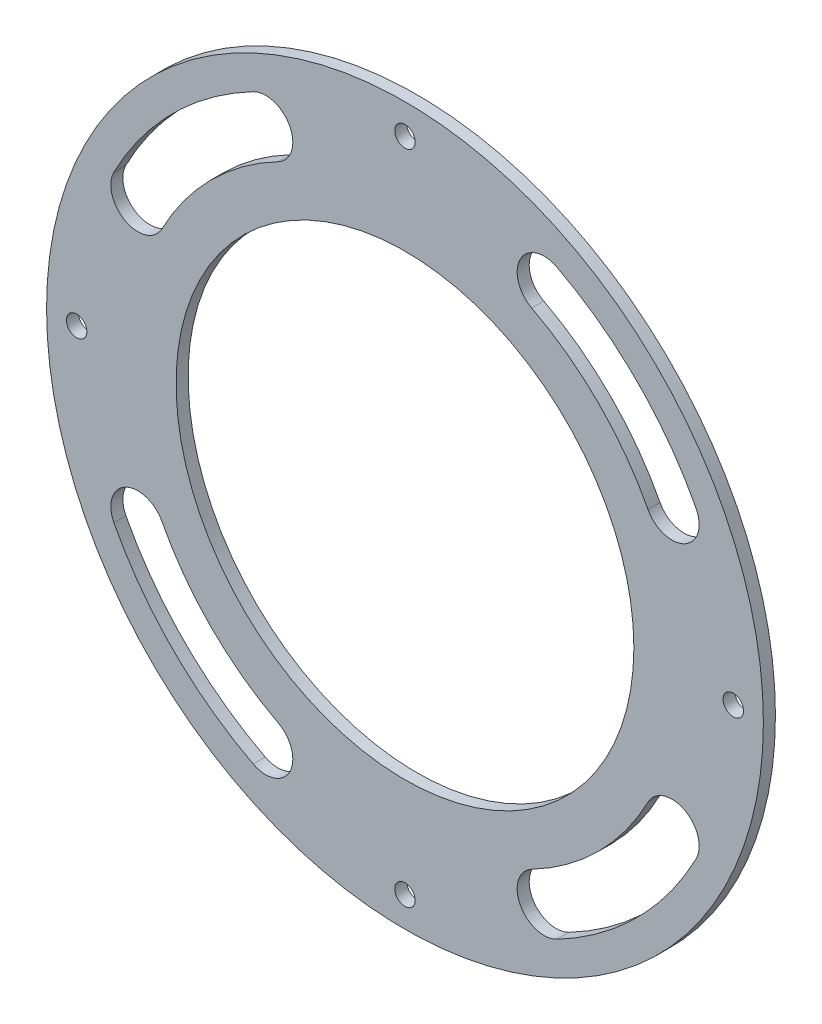
ISO-10303-21;
HEADER;
FILE_DESCRIPTION(('STEP AP214'),'2;1');
FILE_NAME('part.step','',(''),(''),'','','');
FILE_SCHEMA(('AUTOMOTIVE_DESIGN { 1 0 10303 214 1 1 1 1 }'));
ENDSEC;
DATA;
#1=APPLICATION_CONTEXT('core data for automotive mechanical design processes');
#2=APPLICATION_PROTOCOL_DEFINITION('international standard','automotive_design',2000,#1);
#3=PRODUCT_CONTEXT('',#1,'mechanical');
#4=PRODUCT('Part','Part','',(#3));
#5=PRODUCT_RELATED_PRODUCT_CATEGORY('part','',(#4));
#6=PRODUCT_DEFINITION_FORMATION('','',#4);
#7=PRODUCT_DEFINITION_CONTEXT('part definition',#1,'design');
#8=PRODUCT_DEFINITION('design','',#6,#7);
#9=PRODUCT_DEFINITION_SHAPE('','',#8);
#10=(LENGTH_UNIT() NAMED_UNIT(*) SI_UNIT(.MILLI.,.METRE.));
#11=(NAMED_UNIT(*) PLANE_ANGLE_UNIT() SI_UNIT($,.RADIAN.));
#12=(NAMED_UNIT(*) SI_UNIT($,.STERADIAN.) SOLID_ANGLE_UNIT());
#13=UNCERTAINTY_MEASURE_WITH_UNIT(LENGTH_MEASURE(1.E-05),#10,'distance_accuracy_value','');
#14=(GEOMETRIC_REPRESENTATION_CONTEXT(3) GLOBAL_UNCERTAINTY_ASSIGNED_CONTEXT((#13)) GLOBAL_UNIT_ASSIGNED_CONTEXT((#10,
#11,#12)) REPRESENTATION_CONTEXT('',''));
#15=CARTESIAN_POINT('',(0.,0.,0.));
#16=DIRECTION('',(0.,0.,1.));
#17=DIRECTION('',(1.,0.,0.));
#18=AXIS2_PLACEMENT_3D('',#15,#16,#17);
#19=CARTESIAN_POINT('',(0.,0.,2.));
#20=DIRECTION('',(0.,0.,-1.));
#21=DIRECTION('',(-1.,0.,0.));
#22=AXIS2_PLACEMENT_3D('',#19,#20,#21);
#23=CYLINDRICAL_SURFACE('',#22,59.5);
#24=CARTESIAN_POINT('',(0.,0.,2.));
#25=DIRECTION('',(0.,0.,1.));
#26=DIRECTION('',(1.,0.,0.));
#27=AXIS2_PLACEMENT_3D('',#24,#25,#26);
#28=CIRCLE('',#27,59.5);
#29=CARTESIAN_POINT('',(59.5,0.,2.));
#30=VERTEX_POINT('',#29);
#31=EDGE_CURVE('E12',#30,#30,#28,.T.);
#32=ORIENTED_EDGE('',*,*,#31,.F.);
#33=EDGE_LOOP('',(#32));
#34=FACE_BOUND('',#33,.T.);
#35=CARTESIAN_POINT('',(0.,0.,0.));
#36=DIRECTION('',(0.,0.,1.));
#37=DIRECTION('',(1.,0.,0.));
#38=AXIS2_PLACEMENT_3D('',#35,#36,#37);
#39=CIRCLE('',#38,59.5);
#40=CARTESIAN_POINT('',(59.5,0.,0.));
#41=VERTEX_POINT('',#40);
#42=EDGE_CURVE('E65',#41,#41,#39,.T.);
#43=ORIENTED_EDGE('',*,*,#42,.T.);
#44=EDGE_LOOP('',(#43));
#45=FACE_BOUND('',#44,.T.);
#46=ADVANCED_FACE('F61',(#34,#45),#23,.T.);
#47=CARTESIAN_POINT('',(-54.5,5.50341022753642E-13,2.));
#48=DIRECTION('',(0.,0.,-1.));
#49=DIRECTION('',(-1.,0.,0.));
#50=AXIS2_PLACEMENT_3D('',#47,#48,#49);
#51=CYLINDRICAL_SURFACE('',#50,1.7);
#52=CARTESIAN_POINT('',(-54.5,5.50341022753642E-13,2.));
#53=DIRECTION('',(0.,0.,1.));
#54=DIRECTION('',(1.,0.,0.));
#55=AXIS2_PLACEMENT_3D('',#52,#53,#54);
#56=CIRCLE('',#55,1.7);
#57=CARTESIAN_POINT('',(-52.8,5.50341022753642E-13,2.));
#58=VERTEX_POINT('',#57);
#59=EDGE_CURVE('E70',#58,#58,#56,.T.);
#60=ORIENTED_EDGE('',*,*,#59,.T.);
#61=EDGE_LOOP('',(#60));
#62=FACE_BOUND('',#61,.T.);
#63=CARTESIAN_POINT('',(-54.5,5.50341022753642E-13,0.));
#64=DIRECTION('',(0.,0.,1.));
#65=DIRECTION('',(1.,0.,0.));
#66=AXIS2_PLACEMENT_3D('',#63,#64,#65);
#67=CIRCLE('',#66,1.7);
#68=CARTESIAN_POINT('',(-52.8,5.50341022753642E-13,0.));
#69=VERTEX_POINT('',#68);
#70=EDGE_CURVE('E334',#69,#69,#67,.T.);
#71=ORIENTED_EDGE('',*,*,#70,.F.);
#72=EDGE_LOOP('',(#71));
#73=FACE_BOUND('',#72,.T.);
#74=ADVANCED_FACE('F357',(#62,#73),#51,.F.);
#75=CARTESIAN_POINT('',(-5.3218063636451E-13,-54.4999999999995,2.));
#76=DIRECTION('',(0.,0.,-1.));
#77=DIRECTION('',(-1.,0.,0.));
#78=AXIS2_PLACEMENT_3D('',#75,#76,#77);
#79=CYLINDRICAL_SURFACE('',#78,1.7);
#80=CARTESIAN_POINT('',(-5.3218063636451E-13,-54.4999999999995,2.));
#81=DIRECTION('',(0.,0.,1.));
#82=DIRECTION('',(1.,0.,0.));
#83=AXIS2_PLACEMENT_3D('',#80,#81,#82);
#84=CIRCLE('',#83,1.7);
#85=CARTESIAN_POINT('',(1.69999999999947,-54.4999999999995,2.));
#86=VERTEX_POINT('',#85);
#87=EDGE_CURVE('E322',#86,#86,#84,.T.);
#88=ORIENTED_EDGE('',*,*,#87,.T.);
#89=EDGE_LOOP('',(#88));
#90=FACE_BOUND('',#89,.T.);
#91=CARTESIAN_POINT('',(-5.3218063636451E-13,-54.4999999999995,0.));
#92=DIRECTION('',(0.,0.,1.));
#93=DIRECTION('',(1.,0.,0.));
#94=AXIS2_PLACEMENT_3D('',#91,#92,#93);
#95=CIRCLE('',#94,1.7);
#96=CARTESIAN_POINT('',(1.69999999999947,-54.4999999999995,0.));
#97=VERTEX_POINT('',#96);
#98=EDGE_CURVE('E332',#97,#97,#95,.T.);
#99=ORIENTED_EDGE('',*,*,#98,.F.);
#100=EDGE_LOOP('',(#99));
#101=FACE_BOUND('',#100,.T.);
#102=ADVANCED_FACE('F362',(#90,#101),#79,.F.);
#103=CARTESIAN_POINT('',(54.4999999999995,0.,2.));
#104=DIRECTION('',(0.,0.,-1.));
#105=DIRECTION('',(-1.,0.,0.));
#106=AXIS2_PLACEMENT_3D('',#103,#104,#105);
#107=CYLINDRICAL_SURFACE('',#106,1.7);
#108=CARTESIAN_POINT('',(54.4999999999995,0.,2.));
#109=DIRECTION('',(0.,0.,1.));
#110=DIRECTION('',(1.,0.,0.));
#111=AXIS2_PLACEMENT_3D('',#108,#109,#110);
#112=CIRCLE('',#111,1.7);
#113=CARTESIAN_POINT('',(56.1999999999995,0.,2.));
#114=VERTEX_POINT('',#113);
#115=EDGE_CURVE('E319',#114,#114,#112,.T.);
#116=ORIENTED_EDGE('',*,*,#115,.T.);
#117=EDGE_LOOP('',(#116));
#118=FACE_BOUND('',#117,.T.);
#119=CARTESIAN_POINT('',(54.4999999999995,0.,0.));
#120=DIRECTION('',(0.,0.,1.));
#121=DIRECTION('',(1.,0.,0.));
#122=AXIS2_PLACEMENT_3D('',#119,#120,#121);
#123=CIRCLE('',#122,1.7);
#124=CARTESIAN_POINT('',(56.1999999999995,0.,0.));
#125=VERTEX_POINT('',#124);
#126=EDGE_CURVE('E329',#125,#125,#123,.T.);
#127=ORIENTED_EDGE('',*,*,#126,.F.);
#128=EDGE_LOOP('',(#127));
#129=FACE_BOUND('',#128,.T.);
#130=ADVANCED_FACE('F353',(#118,#129),#107,.F.);
#131=CARTESIAN_POINT('',(0.,54.5,2.));
#132=DIRECTION('',(0.,0.,-1.));
#133=DIRECTION('',(-1.,0.,0.));
#134=AXIS2_PLACEMENT_3D('',#131,#132,#133);
#135=CYLINDRICAL_SURFACE('',#134,1.7);
#136=CARTESIAN_POINT('',(0.,54.5,2.));
#137=DIRECTION('',(0.,0.,1.));
#138=DIRECTION('',(1.,0.,0.));
#139=AXIS2_PLACEMENT_3D('',#136,#137,#138);
#140=CIRCLE('',#139,1.7);
#141=CARTESIAN_POINT('',(1.69999999999999,54.5,2.));
#142=VERTEX_POINT('',#141);
#143=EDGE_CURVE('E316',#142,#142,#140,.T.);
#144=ORIENTED_EDGE('',*,*,#143,.T.);
#145=EDGE_LOOP('',(#144));
#146=FACE_BOUND('',#145,.T.);
#147=CARTESIAN_POINT('',(0.,54.5,0.));
#148=DIRECTION('',(0.,0.,1.));
#149=DIRECTION('',(1.,0.,0.));
#150=AXIS2_PLACEMENT_3D('',#147,#148,#149);
#151=CIRCLE('',#150,1.7);
#152=CARTESIAN_POINT('',(1.69999999999999,54.5,0.));
#153=VERTEX_POINT('',#152);
#154=EDGE_CURVE('E313',#153,#153,#151,.T.);
#155=ORIENTED_EDGE('',*,*,#154,.F.);
#156=EDGE_LOOP('',(#155));
#157=FACE_BOUND('',#156,.T.);
#158=ADVANCED_FACE('F63',(#146,#157),#135,.F.);
#159=CARTESIAN_POINT('',(0.,0.,0.));
#160=DIRECTION('',(0.,0.,1.));
#161=DIRECTION('',(1.,0.,0.));
#162=AXIS2_PLACEMENT_3D('',#159,#160,#161);
#163=PLANE('',#162);
#164=CARTESIAN_POINT('',(-23.1202421902823,44.3334456258781,0.));
#165=DIRECTION('',(0.,0.,1.));
#166=DIRECTION('',(0.,1.,0.));
#167=AXIS2_PLACEMENT_3D('',#164,#165,#166);
#168=CIRCLE('',#167,4.5);
#169=CARTESIAN_POINT('',(-21.0394203931569,40.3434355195491,0.));
#170=VERTEX_POINT('',#169);
#171=CARTESIAN_POINT('',(-25.2010639874077,48.3234557322071,0.));
#172=VERTEX_POINT('',#171);
#173=EDGE_CURVE('E186',#170,#172,#168,.T.);
#174=ORIENTED_EDGE('',*,*,#173,.T.);
#175=CARTESIAN_POINT('',(0.,0.,0.));
#176=DIRECTION('',(0.,0.,1.));
#177=DIRECTION('',(0.,1.,0.));
#178=AXIS2_PLACEMENT_3D('',#175,#176,#177);
#179=CIRCLE('',#178,54.5);
#180=CARTESIAN_POINT('',(-48.3234557322076,25.2010639874068,0.));
#181=VERTEX_POINT('',#180);
#182=EDGE_CURVE('E181',#172,#181,#179,.T.);
#183=ORIENTED_EDGE('',*,*,#182,.T.);
#184=CARTESIAN_POINT('',(-44.3334456258785,23.1202421902815,0.));
#185=DIRECTION('',(0.,0.,1.));
#186=DIRECTION('',(0.,1.,0.));
#187=AXIS2_PLACEMENT_3D('',#184,#185,#186);
#188=CIRCLE('',#187,4.5);
#189=CARTESIAN_POINT('',(-40.3434355195495,21.0394203931561,0.));
#190=VERTEX_POINT('',#189);
#191=EDGE_CURVE('E189',#181,#190,#188,.T.);
#192=ORIENTED_EDGE('',*,*,#191,.T.);
#193=CARTESIAN_POINT('',(0.,0.,0.));
#194=DIRECTION('',(0.,0.,1.));
#195=DIRECTION('',(0.,1.,0.));
#196=AXIS2_PLACEMENT_3D('',#193,#194,#195);
#197=CIRCLE('',#196,45.5);
#198=EDGE_CURVE('E193',#170,#190,#197,.T.);
#199=ORIENTED_EDGE('',*,*,#198,.F.);
#200=EDGE_LOOP('',(#174,#183,#192,#199));
#201=FACE_BOUND('',#200,.T.);
#202=CARTESIAN_POINT('',(-44.3334456258782,-23.1202421902821,0.));
#203=DIRECTION('',(0.,0.,1.));
#204=DIRECTION('',(-1.,0.,0.));
#205=AXIS2_PLACEMENT_3D('',#202,#203,#204);
#206=CIRCLE('',#205,4.5);
#207=CARTESIAN_POINT('',(-40.3434355195491,-21.0394203931567,0.));
#208=VERTEX_POINT('',#207);
#209=CARTESIAN_POINT('',(-48.3234557322072,-25.2010639874075,0.));
#210=VERTEX_POINT('',#209);
#211=EDGE_CURVE('E227',#208,#210,#206,.T.);
#212=ORIENTED_EDGE('',*,*,#211,.T.);
#213=CARTESIAN_POINT('',(0.,0.,0.));
#214=DIRECTION('',(0.,0.,1.));
#215=DIRECTION('',(-1.,0.,0.));
#216=AXIS2_PLACEMENT_3D('',#213,#214,#215);
#217=CIRCLE('',#216,54.5);
#218=CARTESIAN_POINT('',(-25.201063987407,-48.3234557322075,0.));
#219=VERTEX_POINT('',#218);
#220=EDGE_CURVE('E218',#210,#219,#217,.T.);
#221=ORIENTED_EDGE('',*,*,#220,.T.);
#222=CARTESIAN_POINT('',(-23.1202421902816,-44.3334456258784,0.));
#223=DIRECTION('',(0.,0.,1.));
#224=DIRECTION('',(-1.,0.,0.));
#225=AXIS2_PLACEMENT_3D('',#222,#223,#224);
#226=CIRCLE('',#225,4.5);
#227=CARTESIAN_POINT('',(-21.0394203931563,-40.3434355195494,0.));
#228=VERTEX_POINT('',#227);
#229=EDGE_CURVE('E221',#219,#228,#226,.T.);
#230=ORIENTED_EDGE('',*,*,#229,.T.);
#231=CARTESIAN_POINT('',(0.,0.,0.));
#232=DIRECTION('',(0.,0.,1.));
#233=DIRECTION('',(-1.,0.,0.));
#234=AXIS2_PLACEMENT_3D('',#231,#232,#233);
#235=CIRCLE('',#234,45.5);
#236=EDGE_CURVE('E225',#208,#228,#235,.T.);
#237=ORIENTED_EDGE('',*,*,#236,.F.);
#238=EDGE_LOOP('',(#212,#221,#230,#237));
#239=FACE_BOUND('',#238,.T.);
#240=CARTESIAN_POINT('',(23.1202421902826,-44.3334456258779,0.));
#241=DIRECTION('',(0.,0.,1.));
#242=DIRECTION('',(0.,-1.,0.));
#243=AXIS2_PLACEMENT_3D('',#240,#241,#242);
#244=CIRCLE('',#243,4.5);
#245=CARTESIAN_POINT('',(21.0394203931572,-40.3434355195489,0.));
#246=VERTEX_POINT('',#245);
#247=CARTESIAN_POINT('',(25.201063987408,-48.323455732207,0.));
#248=VERTEX_POINT('',#247);
#249=EDGE_CURVE('E257',#246,#248,#244,.T.);
#250=ORIENTED_EDGE('',*,*,#249,.T.);
#251=CARTESIAN_POINT('',(0.,0.,0.));
#252=DIRECTION('',(0.,0.,1.));
#253=DIRECTION('',(0.,-1.,0.));
#254=AXIS2_PLACEMENT_3D('',#251,#252,#253);
#255=CIRCLE('',#254,54.5);
#256=CARTESIAN_POINT('',(48.3234557322078,-25.2010639874065,0.));
#257=VERTEX_POINT('',#256);
#258=EDGE_CURVE('E247',#248,#257,#255,.T.);
#259=ORIENTED_EDGE('',*,*,#258,.T.);
#260=CARTESIAN_POINT('',(44.3334456258787,-23.1202421902812,0.));
#261=DIRECTION('',(0.,0.,1.));
#262=DIRECTION('',(0.,-1.,0.));
#263=AXIS2_PLACEMENT_3D('',#260,#261,#262);
#264=CIRCLE('',#263,4.5);
#265=CARTESIAN_POINT('',(40.3434355195496,-21.0394203931559,0.));
#266=VERTEX_POINT('',#265);
#267=EDGE_CURVE('E250',#257,#266,#264,.T.);
#268=ORIENTED_EDGE('',*,*,#267,.T.);
#269=CARTESIAN_POINT('',(0.,0.,0.));
#270=DIRECTION('',(0.,0.,1.));
#271=DIRECTION('',(0.,-1.,0.));
#272=AXIS2_PLACEMENT_3D('',#269,#270,#271);
#273=CIRCLE('',#272,45.5);
#274=EDGE_CURVE('E254',#246,#266,#273,.T.);
#275=ORIENTED_EDGE('',*,*,#274,.F.);
#276=EDGE_LOOP('',(#250,#259,#268,#275));
#277=FACE_BOUND('',#276,.T.);
#278=CARTESIAN_POINT('',(44.3334456258782,23.1202421902821,0.));
#279=DIRECTION('',(0.,0.,1.));
#280=DIRECTION('',(1.,0.,0.));
#281=AXIS2_PLACEMENT_3D('',#278,#279,#280);
#282=CIRCLE('',#281,4.5);
#283=CARTESIAN_POINT('',(40.3434355195491,21.0394203931567,0.));
#284=VERTEX_POINT('',#283);
#285=CARTESIAN_POINT('',(48.3234557322072,25.2010639874075,0.));
#286=VERTEX_POINT('',#285);
#287=EDGE_CURVE('E288',#284,#286,#282,.T.);
#288=ORIENTED_EDGE('',*,*,#287,.T.);
#289=CARTESIAN_POINT('',(0.,0.,0.));
#290=DIRECTION('',(0.,0.,1.));
#291=DIRECTION('',(1.,0.,0.));
#292=AXIS2_PLACEMENT_3D('',#289,#290,#291);
#293=CIRCLE('',#292,54.5);
#294=CARTESIAN_POINT('',(25.201063987407,48.3234557322075,0.));
#295=VERTEX_POINT('',#294);
#296=EDGE_CURVE('E278',#286,#295,#293,.T.);
#297=ORIENTED_EDGE('',*,*,#296,.T.);
#298=CARTESIAN_POINT('',(23.1202421902816,44.3334456258784,0.));
#299=DIRECTION('',(0.,0.,1.));
#300=DIRECTION('',(1.,0.,0.));
#301=AXIS2_PLACEMENT_3D('',#298,#299,#300);
#302=CIRCLE('',#301,4.5);
#303=CARTESIAN_POINT('',(21.0394203931563,40.3434355195494,0.));
#304=VERTEX_POINT('',#303);
#305=EDGE_CURVE('E281',#295,#304,#302,.T.);
#306=ORIENTED_EDGE('',*,*,#305,.T.);
#307=CARTESIAN_POINT('',(0.,0.,0.));
#308=DIRECTION('',(0.,0.,1.));
#309=DIRECTION('',(1.,0.,0.));
#310=AXIS2_PLACEMENT_3D('',#307,#308,#309);
#311=CIRCLE('',#310,45.5);
#312=EDGE_CURVE('E285',#284,#304,#311,.T.);
#313=ORIENTED_EDGE('',*,*,#312,.F.);
#314=EDGE_LOOP('',(#288,#297,#306,#313));
#315=FACE_BOUND('',#314,.T.);
#316=CARTESIAN_POINT('',(0.,0.,0.));
#317=DIRECTION('',(0.,0.,1.));
#318=DIRECTION('',(1.,0.,0.));
#319=AXIS2_PLACEMENT_3D('',#316,#317,#318);
#320=CIRCLE('',#319,38.);
#321=CARTESIAN_POINT('',(38.,0.,0.));
#322=VERTEX_POINT('',#321);
#323=EDGE_CURVE('E310',#322,#322,#320,.T.);
#324=ORIENTED_EDGE('',*,*,#323,.T.);
#325=EDGE_LOOP('',(#324));
#326=FACE_BOUND('',#325,.T.);
#327=ORIENTED_EDGE('',*,*,#154,.T.);
#328=EDGE_LOOP('',(#327));
#329=FACE_BOUND('',#328,.T.);
#330=ORIENTED_EDGE('',*,*,#126,.T.);
#331=EDGE_LOOP('',(#330));
#332=FACE_BOUND('',#331,.T.);
#333=ORIENTED_EDGE('',*,*,#98,.T.);
#334=EDGE_LOOP('',(#333));
#335=FACE_BOUND('',#334,.T.);
#336=ORIENTED_EDGE('',*,*,#70,.T.);
#337=EDGE_LOOP('',(#336));
#338=FACE_BOUND('',#337,.T.);
#339=ORIENTED_EDGE('',*,*,#42,.F.);
#340=EDGE_LOOP('',(#339));
#341=FACE_BOUND('',#340,.T.);
#342=ADVANCED_FACE('F195',(#201,#239,#277,#315,#326,#329,#332,#335,#338,#341),#163,.F.);
#343=CARTESIAN_POINT('',(0.,0.,2.));
#344=DIRECTION('',(0.,0.,1.));
#345=DIRECTION('',(1.,0.,0.));
#346=AXIS2_PLACEMENT_3D('',#343,#344,#345);
#347=PLANE('',#346);
#348=CARTESIAN_POINT('',(0.,0.,2.));
#349=DIRECTION('',(0.,0.,1.));
#350=DIRECTION('',(0.,1.,0.));
#351=AXIS2_PLACEMENT_3D('',#348,#349,#350);
#352=CIRCLE('',#351,54.5);
#353=CARTESIAN_POINT('',(-25.2010639874077,48.3234557322071,2.));
#354=VERTEX_POINT('',#353);
#355=CARTESIAN_POINT('',(-48.3234557322076,25.2010639874068,2.));
#356=VERTEX_POINT('',#355);
#357=EDGE_CURVE('E184',#354,#356,#352,.T.);
#358=ORIENTED_EDGE('',*,*,#357,.F.);
#359=CARTESIAN_POINT('',(-23.1202421902823,44.3334456258781,2.));
#360=DIRECTION('',(0.,0.,1.));
#361=DIRECTION('',(0.,1.,0.));
#362=AXIS2_PLACEMENT_3D('',#359,#360,#361);
#363=CIRCLE('',#362,4.5);
#364=CARTESIAN_POINT('',(-21.0394203931569,40.3434355195491,2.));
#365=VERTEX_POINT('',#364);
#366=EDGE_CURVE('E198',#365,#354,#363,.T.);
#367=ORIENTED_EDGE('',*,*,#366,.F.);
#368=CARTESIAN_POINT('',(0.,0.,2.));
#369=DIRECTION('',(0.,0.,1.));
#370=DIRECTION('',(0.,1.,0.));
#371=AXIS2_PLACEMENT_3D('',#368,#369,#370);
#372=CIRCLE('',#371,45.5);
#373=CARTESIAN_POINT('',(-40.3434355195495,21.0394203931561,2.));
#374=VERTEX_POINT('',#373);
#375=EDGE_CURVE('E201',#365,#374,#372,.T.);
#376=ORIENTED_EDGE('',*,*,#375,.T.);
#377=CARTESIAN_POINT('',(-44.3334456258785,23.1202421902815,2.));
#378=DIRECTION('',(0.,0.,1.));
#379=DIRECTION('',(0.,1.,0.));
#380=AXIS2_PLACEMENT_3D('',#377,#378,#379);
#381=CIRCLE('',#380,4.5);
#382=EDGE_CURVE('E207',#356,#374,#381,.T.);
#383=ORIENTED_EDGE('',*,*,#382,.F.);
#384=EDGE_LOOP('',(#358,#367,#376,#383));
#385=FACE_BOUND('',#384,.T.);
#386=CARTESIAN_POINT('',(0.,0.,2.));
#387=DIRECTION('',(0.,0.,1.));
#388=DIRECTION('',(-1.,0.,0.));
#389=AXIS2_PLACEMENT_3D('',#386,#387,#388);
#390=CIRCLE('',#389,54.5);
#391=CARTESIAN_POINT('',(-48.3234557322072,-25.2010639874075,2.));
#392=VERTEX_POINT('',#391);
#393=CARTESIAN_POINT('',(-25.201063987407,-48.3234557322075,2.));
#394=VERTEX_POINT('',#393);
#395=EDGE_CURVE('E231',#392,#394,#390,.T.);
#396=ORIENTED_EDGE('',*,*,#395,.F.);
#397=CARTESIAN_POINT('',(-44.3334456258782,-23.1202421902821,2.));
#398=DIRECTION('',(0.,0.,1.));
#399=DIRECTION('',(-1.,0.,0.));
#400=AXIS2_PLACEMENT_3D('',#397,#398,#399);
#401=CIRCLE('',#400,4.5);
#402=CARTESIAN_POINT('',(-40.3434355195491,-21.0394203931567,2.));
#403=VERTEX_POINT('',#402);
#404=EDGE_CURVE('E222',#403,#392,#401,.T.);
#405=ORIENTED_EDGE('',*,*,#404,.F.);
#406=CARTESIAN_POINT('',(0.,0.,2.));
#407=DIRECTION('',(0.,0.,1.));
#408=DIRECTION('',(-1.,0.,0.));
#409=AXIS2_PLACEMENT_3D('',#406,#407,#408);
#410=CIRCLE('',#409,45.5);
#411=CARTESIAN_POINT('',(-21.0394203931563,-40.3434355195494,2.));
#412=VERTEX_POINT('',#411);
#413=EDGE_CURVE('E236',#403,#412,#410,.T.);
#414=ORIENTED_EDGE('',*,*,#413,.T.);
#415=CARTESIAN_POINT('',(-23.1202421902816,-44.3334456258784,2.));
#416=DIRECTION('',(0.,0.,1.));
#417=DIRECTION('',(-1.,0.,0.));
#418=AXIS2_PLACEMENT_3D('',#415,#416,#417);
#419=CIRCLE('',#418,4.5);
#420=EDGE_CURVE('E233',#394,#412,#419,.T.);
#421=ORIENTED_EDGE('',*,*,#420,.F.);
#422=EDGE_LOOP('',(#396,#405,#414,#421));
#423=FACE_BOUND('',#422,.T.);
#424=CARTESIAN_POINT('',(0.,0.,2.));
#425=DIRECTION('',(0.,0.,1.));
#426=DIRECTION('',(0.,-1.,0.));
#427=AXIS2_PLACEMENT_3D('',#424,#425,#426);
#428=CIRCLE('',#427,54.5);
#429=CARTESIAN_POINT('',(25.201063987408,-48.323455732207,2.));
#430=VERTEX_POINT('',#429);
#431=CARTESIAN_POINT('',(48.3234557322078,-25.2010639874065,2.));
#432=VERTEX_POINT('',#431);
#433=EDGE_CURVE('E261',#430,#432,#428,.T.);
#434=ORIENTED_EDGE('',*,*,#433,.F.);
#435=CARTESIAN_POINT('',(23.1202421902826,-44.3334456258779,2.));
#436=DIRECTION('',(0.,0.,1.));
#437=DIRECTION('',(0.,-1.,0.));
#438=AXIS2_PLACEMENT_3D('',#435,#436,#437);
#439=CIRCLE('',#438,4.5);
#440=CARTESIAN_POINT('',(21.0394203931572,-40.3434355195489,2.));
#441=VERTEX_POINT('',#440);
#442=EDGE_CURVE('E251',#441,#430,#439,.T.);
#443=ORIENTED_EDGE('',*,*,#442,.F.);
#444=CARTESIAN_POINT('',(0.,0.,2.));
#445=DIRECTION('',(0.,0.,1.));
#446=DIRECTION('',(0.,-1.,0.));
#447=AXIS2_PLACEMENT_3D('',#444,#445,#446);
#448=CIRCLE('',#447,45.5);
#449=CARTESIAN_POINT('',(40.3434355195496,-21.0394203931559,2.));
#450=VERTEX_POINT('',#449);
#451=EDGE_CURVE('E266',#441,#450,#448,.T.);
#452=ORIENTED_EDGE('',*,*,#451,.T.);
#453=CARTESIAN_POINT('',(44.3334456258787,-23.1202421902812,2.));
#454=DIRECTION('',(0.,0.,1.));
#455=DIRECTION('',(0.,-1.,0.));
#456=AXIS2_PLACEMENT_3D('',#453,#454,#455);
#457=CIRCLE('',#456,4.5);
#458=EDGE_CURVE('E263',#432,#450,#457,.T.);
#459=ORIENTED_EDGE('',*,*,#458,.F.);
#460=EDGE_LOOP('',(#434,#443,#452,#459));
#461=FACE_BOUND('',#460,.T.);
#462=CARTESIAN_POINT('',(0.,0.,2.));
#463=DIRECTION('',(0.,0.,1.));
#464=DIRECTION('',(1.,0.,0.));
#465=AXIS2_PLACEMENT_3D('',#462,#463,#464);
#466=CIRCLE('',#465,54.5);
#467=CARTESIAN_POINT('',(48.3234557322072,25.2010639874075,2.));
#468=VERTEX_POINT('',#467);
#469=CARTESIAN_POINT('',(25.201063987407,48.3234557322075,2.));
#470=VERTEX_POINT('',#469);
#471=EDGE_CURVE('E214',#468,#470,#466,.T.);
#472=ORIENTED_EDGE('',*,*,#471,.F.);
#473=CARTESIAN_POINT('',(44.3334456258782,23.1202421902821,2.));
#474=DIRECTION('',(0.,0.,1.));
#475=DIRECTION('',(1.,0.,0.));
#476=AXIS2_PLACEMENT_3D('',#473,#474,#475);
#477=CIRCLE('',#476,4.5);
#478=CARTESIAN_POINT('',(40.3434355195491,21.0394203931567,2.));
#479=VERTEX_POINT('',#478);
#480=EDGE_CURVE('E282',#479,#468,#477,.T.);
#481=ORIENTED_EDGE('',*,*,#480,.F.);
#482=CARTESIAN_POINT('',(0.,0.,2.));
#483=DIRECTION('',(0.,0.,1.));
#484=DIRECTION('',(1.,0.,0.));
#485=AXIS2_PLACEMENT_3D('',#482,#483,#484);
#486=CIRCLE('',#485,45.5);
#487=CARTESIAN_POINT('',(21.0394203931563,40.3434355195494,2.));
#488=VERTEX_POINT('',#487);
#489=EDGE_CURVE('E296',#479,#488,#486,.T.);
#490=ORIENTED_EDGE('',*,*,#489,.T.);
#491=CARTESIAN_POINT('',(23.1202421902816,44.3334456258784,2.));
#492=DIRECTION('',(0.,0.,1.));
#493=DIRECTION('',(1.,0.,0.));
#494=AXIS2_PLACEMENT_3D('',#491,#492,#493);
#495=CIRCLE('',#494,4.5);
#496=EDGE_CURVE('E293',#470,#488,#495,.T.);
#497=ORIENTED_EDGE('',*,*,#496,.F.);
#498=EDGE_LOOP('',(#472,#481,#490,#497));
#499=FACE_BOUND('',#498,.T.);
#500=CARTESIAN_POINT('',(0.,0.,2.));
#501=DIRECTION('',(0.,0.,1.));
#502=DIRECTION('',(1.,0.,0.));
#503=AXIS2_PLACEMENT_3D('',#500,#501,#502);
#504=CIRCLE('',#503,38.);
#505=CARTESIAN_POINT('',(38.,0.,2.));
#506=VERTEX_POINT('',#505);
#507=EDGE_CURVE('E303',#506,#506,#504,.T.);
#508=ORIENTED_EDGE('',*,*,#507,.F.);
#509=EDGE_LOOP('',(#508));
#510=FACE_BOUND('',#509,.T.);
#511=ORIENTED_EDGE('',*,*,#143,.F.);
#512=EDGE_LOOP('',(#511));
#513=FACE_BOUND('',#512,.T.);
#514=ORIENTED_EDGE('',*,*,#115,.F.);
#515=EDGE_LOOP('',(#514));
#516=FACE_BOUND('',#515,.T.);
#517=ORIENTED_EDGE('',*,*,#87,.F.);
#518=EDGE_LOOP('',(#517));
#519=FACE_BOUND('',#518,.T.);
#520=ORIENTED_EDGE('',*,*,#59,.F.);
#521=EDGE_LOOP('',(#520));
#522=FACE_BOUND('',#521,.T.);
#523=ORIENTED_EDGE('',*,*,#31,.T.);
#524=EDGE_LOOP('',(#523));
#525=FACE_BOUND('',#524,.T.);
#526=ADVANCED_FACE('F343',(#385,#423,#461,#499,#510,#513,#516,#519,#522,#525),#347,.T.);
#527=CARTESIAN_POINT('',(0.,0.,0.));
#528=DIRECTION('',(0.,0.,1.));
#529=DIRECTION('',(1.,0.,0.));
#530=AXIS2_PLACEMENT_3D('',#527,#528,#529);
#531=CYLINDRICAL_SURFACE('',#530,38.);
#532=ORIENTED_EDGE('',*,*,#323,.F.);
#533=EDGE_LOOP('',(#532));
#534=FACE_BOUND('',#533,.T.);
#535=ORIENTED_EDGE('',*,*,#507,.T.);
#536=EDGE_LOOP('',(#535));
#537=FACE_BOUND('',#536,.T.);
#538=ADVANCED_FACE('F349',(#534,#537),#531,.F.);
#539=CARTESIAN_POINT('',(0.,0.,0.));
#540=DIRECTION('',(0.,0.,1.));
#541=DIRECTION('',(1.,0.,0.));
#542=AXIS2_PLACEMENT_3D('',#539,#540,#541);
#543=CYLINDRICAL_SURFACE('',#542,54.5);
#544=ORIENTED_EDGE('',*,*,#471,.T.);
#545=DIRECTION('',(0.,0.,1.));
#546=VECTOR('',#545,1.);
#547=CARTESIAN_POINT('',(25.201063987407,48.3234557322075,0.));
#548=LINE('',#547,#546);
#549=EDGE_CURVE('E291',#295,#470,#548,.T.);
#550=ORIENTED_EDGE('',*,*,#549,.F.);
#551=ORIENTED_EDGE('',*,*,#296,.F.);
#552=DIRECTION('',(0.,0.,1.));
#553=VECTOR('',#552,1.);
#554=CARTESIAN_POINT('',(48.3234557322072,25.2010639874075,0.));
#555=LINE('',#554,#553);
#556=EDGE_CURVE('E301',#286,#468,#555,.T.);
#557=ORIENTED_EDGE('',*,*,#556,.T.);
#558=EDGE_LOOP('',(#544,#550,#551,#557));
#559=FACE_BOUND('',#558,.T.);
#560=ADVANCED_FACE('F402',(#559),#543,.F.);
#561=CARTESIAN_POINT('',(44.3334456258782,23.1202421902821,0.));
#562=DIRECTION('',(0.,0.,1.));
#563=DIRECTION('',(1.,0.,0.));
#564=AXIS2_PLACEMENT_3D('',#561,#562,#563);
#565=CYLINDRICAL_SURFACE('',#564,4.5);
#566=ORIENTED_EDGE('',*,*,#480,.T.);
#567=ORIENTED_EDGE('',*,*,#556,.F.);
#568=ORIENTED_EDGE('',*,*,#287,.F.);
#569=DIRECTION('',(0.,0.,1.));
#570=VECTOR('',#569,1.);
#571=CARTESIAN_POINT('',(40.3434355195491,21.0394203931567,0.));
#572=LINE('',#571,#570);
#573=EDGE_CURVE('E304',#284,#479,#572,.T.);
#574=ORIENTED_EDGE('',*,*,#573,.T.);
#575=EDGE_LOOP('',(#566,#567,#568,#574));
#576=FACE_BOUND('',#575,.T.);
#577=ADVANCED_FACE('F412',(#576),#565,.F.);
#578=CARTESIAN_POINT('',(0.,0.,0.));
#579=DIRECTION('',(0.,0.,1.));
#580=DIRECTION('',(1.,0.,0.));
#581=AXIS2_PLACEMENT_3D('',#578,#579,#580);
#582=CYLINDRICAL_SURFACE('',#581,45.5);
#583=ORIENTED_EDGE('',*,*,#489,.F.);
#584=ORIENTED_EDGE('',*,*,#573,.F.);
#585=ORIENTED_EDGE('',*,*,#312,.T.);
#586=DIRECTION('',(0.,0.,1.));
#587=VECTOR('',#586,1.);
#588=CARTESIAN_POINT('',(21.0394203931563,40.3434355195494,0.));
#589=LINE('',#588,#587);
#590=EDGE_CURVE('E306',#304,#488,#589,.T.);
#591=ORIENTED_EDGE('',*,*,#590,.T.);
#592=EDGE_LOOP('',(#583,#584,#585,#591));
#593=FACE_BOUND('',#592,.T.);
#594=ADVANCED_FACE('F421',(#593),#582,.T.);
#595=CARTESIAN_POINT('',(23.1202421902816,44.3334456258784,0.));
#596=DIRECTION('',(0.,0.,1.));
#597=DIRECTION('',(1.,0.,0.));
#598=AXIS2_PLACEMENT_3D('',#595,#596,#597);
#599=CYLINDRICAL_SURFACE('',#598,4.5);
#600=ORIENTED_EDGE('',*,*,#496,.T.);
#601=ORIENTED_EDGE('',*,*,#590,.F.);
#602=ORIENTED_EDGE('',*,*,#305,.F.);
#603=ORIENTED_EDGE('',*,*,#549,.T.);
#604=EDGE_LOOP('',(#600,#601,#602,#603));
#605=FACE_BOUND('',#604,.T.);
#606=ADVANCED_FACE('F429',(#605),#599,.F.);
#607=CARTESIAN_POINT('',(0.,0.,0.));
#608=DIRECTION('',(0.,0.,1.));
#609=DIRECTION('',(1.,0.,0.));
#610=AXIS2_PLACEMENT_3D('',#607,#608,#609);
#611=CYLINDRICAL_SURFACE('',#610,54.5);
#612=ORIENTED_EDGE('',*,*,#433,.T.);
#613=DIRECTION('',(0.,0.,1.));
#614=VECTOR('',#613,1.);
#615=CARTESIAN_POINT('',(48.3234557322078,-25.2010639874065,0.));
#616=LINE('',#615,#614);
#617=EDGE_CURVE('E260',#257,#432,#616,.T.);
#618=ORIENTED_EDGE('',*,*,#617,.F.);
#619=ORIENTED_EDGE('',*,*,#258,.F.);
#620=DIRECTION('',(0.,0.,1.));
#621=VECTOR('',#620,1.);
#622=CARTESIAN_POINT('',(25.201063987408,-48.323455732207,0.));
#623=LINE('',#622,#621);
#624=EDGE_CURVE('E234',#248,#430,#623,.T.);
#625=ORIENTED_EDGE('',*,*,#624,.T.);
#626=EDGE_LOOP('',(#612,#618,#619,#625));
#627=FACE_BOUND('',#626,.T.);
#628=ADVANCED_FACE('F437',(#627),#611,.F.);
#629=CARTESIAN_POINT('',(23.1202421902826,-44.3334456258779,0.));
#630=DIRECTION('',(0.,0.,1.));
#631=DIRECTION('',(1.,0.,0.));
#632=AXIS2_PLACEMENT_3D('',#629,#630,#631);
#633=CYLINDRICAL_SURFACE('',#632,4.5);
#634=ORIENTED_EDGE('',*,*,#442,.T.);
#635=ORIENTED_EDGE('',*,*,#624,.F.);
#636=ORIENTED_EDGE('',*,*,#249,.F.);
#637=DIRECTION('',(0.,0.,1.));
#638=VECTOR('',#637,1.);
#639=CARTESIAN_POINT('',(21.0394203931572,-40.3434355195489,0.));
#640=LINE('',#639,#638);
#641=EDGE_CURVE('E272',#246,#441,#640,.T.);
#642=ORIENTED_EDGE('',*,*,#641,.T.);
#643=EDGE_LOOP('',(#634,#635,#636,#642));
#644=FACE_BOUND('',#643,.T.);
#645=ADVANCED_FACE('F450',(#644),#633,.F.);
#646=CARTESIAN_POINT('',(0.,0.,0.));
#647=DIRECTION('',(0.,0.,1.));
#648=DIRECTION('',(1.,0.,0.));
#649=AXIS2_PLACEMENT_3D('',#646,#647,#648);
#650=CYLINDRICAL_SURFACE('',#649,45.5);
#651=ORIENTED_EDGE('',*,*,#451,.F.);
#652=ORIENTED_EDGE('',*,*,#641,.F.);
#653=ORIENTED_EDGE('',*,*,#274,.T.);
#654=DIRECTION('',(0.,0.,1.));
#655=VECTOR('',#654,1.);
#656=CARTESIAN_POINT('',(40.3434355195496,-21.0394203931559,0.));
#657=LINE('',#656,#655);
#658=EDGE_CURVE('E274',#266,#450,#657,.T.);
#659=ORIENTED_EDGE('',*,*,#658,.T.);
#660=EDGE_LOOP('',(#651,#652,#653,#659));
#661=FACE_BOUND('',#660,.T.);
#662=ADVANCED_FACE('F460',(#661),#650,.T.);
#663=CARTESIAN_POINT('',(44.3334456258787,-23.1202421902812,0.));
#664=DIRECTION('',(0.,0.,1.));
#665=DIRECTION('',(1.,0.,0.));
#666=AXIS2_PLACEMENT_3D('',#663,#664,#665);
#667=CYLINDRICAL_SURFACE('',#666,4.5);
#668=ORIENTED_EDGE('',*,*,#458,.T.);
#669=ORIENTED_EDGE('',*,*,#658,.F.);
#670=ORIENTED_EDGE('',*,*,#267,.F.);
#671=ORIENTED_EDGE('',*,*,#617,.T.);
#672=EDGE_LOOP('',(#668,#669,#670,#671));
#673=FACE_BOUND('',#672,.T.);
#674=ADVANCED_FACE('F470',(#673),#667,.F.);
#675=CARTESIAN_POINT('',(0.,0.,0.));
#676=DIRECTION('',(0.,0.,1.));
#677=DIRECTION('',(1.,0.,0.));
#678=AXIS2_PLACEMENT_3D('',#675,#676,#677);
#679=CYLINDRICAL_SURFACE('',#678,54.5);
#680=ORIENTED_EDGE('',*,*,#395,.T.);
#681=DIRECTION('',(0.,0.,1.));
#682=VECTOR('',#681,1.);
#683=CARTESIAN_POINT('',(-25.201063987407,-48.3234557322075,0.));
#684=LINE('',#683,#682);
#685=EDGE_CURVE('E230',#219,#394,#684,.T.);
#686=ORIENTED_EDGE('',*,*,#685,.F.);
#687=ORIENTED_EDGE('',*,*,#220,.F.);
#688=DIRECTION('',(0.,0.,1.));
#689=VECTOR('',#688,1.);
#690=CARTESIAN_POINT('',(-48.3234557322072,-25.2010639874075,0.));
#691=LINE('',#690,#689);
#692=EDGE_CURVE('E208',#210,#392,#691,.T.);
#693=ORIENTED_EDGE('',*,*,#692,.T.);
#694=EDGE_LOOP('',(#680,#686,#687,#693));
#695=FACE_BOUND('',#694,.T.);
#696=ADVANCED_FACE('F480',(#695),#679,.F.);
#697=CARTESIAN_POINT('',(-44.3334456258782,-23.1202421902821,0.));
#698=DIRECTION('',(0.,0.,1.));
#699=DIRECTION('',(1.,0.,0.));
#700=AXIS2_PLACEMENT_3D('',#697,#698,#699);
#701=CYLINDRICAL_SURFACE('',#700,4.5);
#702=ORIENTED_EDGE('',*,*,#404,.T.);
#703=ORIENTED_EDGE('',*,*,#692,.F.);
#704=ORIENTED_EDGE('',*,*,#211,.F.);
#705=DIRECTION('',(0.,0.,1.));
#706=VECTOR('',#705,1.);
#707=CARTESIAN_POINT('',(-40.3434355195491,-21.0394203931567,0.));
#708=LINE('',#707,#706);
#709=EDGE_CURVE('E242',#208,#403,#708,.T.);
#710=ORIENTED_EDGE('',*,*,#709,.T.);
#711=EDGE_LOOP('',(#702,#703,#704,#710));
#712=FACE_BOUND('',#711,.T.);
#713=ADVANCED_FACE('F490',(#712),#701,.F.);
#714=CARTESIAN_POINT('',(0.,0.,0.));
#715=DIRECTION('',(0.,0.,1.));
#716=DIRECTION('',(1.,0.,0.));
#717=AXIS2_PLACEMENT_3D('',#714,#715,#716);
#718=CYLINDRICAL_SURFACE('',#717,45.5);
#719=ORIENTED_EDGE('',*,*,#413,.F.);
#720=ORIENTED_EDGE('',*,*,#709,.F.);
#721=ORIENTED_EDGE('',*,*,#236,.T.);
#722=DIRECTION('',(0.,0.,1.));
#723=VECTOR('',#722,1.);
#724=CARTESIAN_POINT('',(-21.0394203931563,-40.3434355195494,0.));
#725=LINE('',#724,#723);
#726=EDGE_CURVE('E86',#228,#412,#725,.T.);
#727=ORIENTED_EDGE('',*,*,#726,.T.);
#728=EDGE_LOOP('',(#719,#720,#721,#727));
#729=FACE_BOUND('',#728,.T.);
#730=ADVANCED_FACE('F500',(#729),#718,.T.);
#731=CARTESIAN_POINT('',(-23.1202421902816,-44.3334456258784,0.));
#732=DIRECTION('',(0.,0.,1.));
#733=DIRECTION('',(1.,0.,0.));
#734=AXIS2_PLACEMENT_3D('',#731,#732,#733);
#735=CYLINDRICAL_SURFACE('',#734,4.5);
#736=ORIENTED_EDGE('',*,*,#420,.T.);
#737=ORIENTED_EDGE('',*,*,#726,.F.);
#738=ORIENTED_EDGE('',*,*,#229,.F.);
#739=ORIENTED_EDGE('',*,*,#685,.T.);
#740=EDGE_LOOP('',(#736,#737,#738,#739));
#741=FACE_BOUND('',#740,.T.);
#742=ADVANCED_FACE('F510',(#741),#735,.F.);
#743=CARTESIAN_POINT('',(0.,0.,0.));
#744=DIRECTION('',(0.,0.,1.));
#745=DIRECTION('',(1.,0.,0.));
#746=AXIS2_PLACEMENT_3D('',#743,#744,#745);
#747=CYLINDRICAL_SURFACE('',#746,54.5);
#748=ORIENTED_EDGE('',*,*,#357,.T.);
#749=DIRECTION('',(0.,0.,1.));
#750=VECTOR('',#749,1.);
#751=CARTESIAN_POINT('',(-48.3234557322076,25.2010639874068,0.));
#752=LINE('',#751,#750);
#753=EDGE_CURVE('E178',#181,#356,#752,.T.);
#754=ORIENTED_EDGE('',*,*,#753,.F.);
#755=ORIENTED_EDGE('',*,*,#182,.F.);
#756=DIRECTION('',(0.,0.,1.));
#757=VECTOR('',#756,1.);
#758=CARTESIAN_POINT('',(-25.2010639874077,48.3234557322071,0.));
#759=LINE('',#758,#757);
#760=EDGE_CURVE('E212',#172,#354,#759,.T.);
#761=ORIENTED_EDGE('',*,*,#760,.T.);
#762=EDGE_LOOP('',(#748,#754,#755,#761));
#763=FACE_BOUND('',#762,.T.);
#764=ADVANCED_FACE('F179',(#763),#747,.F.);
#765=CARTESIAN_POINT('',(-23.1202421902823,44.3334456258781,0.));
#766=DIRECTION('',(0.,0.,1.));
#767=DIRECTION('',(1.,0.,0.));
#768=AXIS2_PLACEMENT_3D('',#765,#766,#767);
#769=CYLINDRICAL_SURFACE('',#768,4.5);
#770=ORIENTED_EDGE('',*,*,#366,.T.);
#771=ORIENTED_EDGE('',*,*,#760,.F.);
#772=ORIENTED_EDGE('',*,*,#173,.F.);
#773=DIRECTION('',(0.,0.,1.));
#774=VECTOR('',#773,1.);
#775=CARTESIAN_POINT('',(-21.0394203931569,40.3434355195491,0.));
#776=LINE('',#775,#774);
#777=EDGE_CURVE('E215',#170,#365,#776,.T.);
#778=ORIENTED_EDGE('',*,*,#777,.T.);
#779=EDGE_LOOP('',(#770,#771,#772,#778));
#780=FACE_BOUND('',#779,.T.);
#781=ADVANCED_FACE('F528',(#780),#769,.F.);
#782=CARTESIAN_POINT('',(0.,0.,0.));
#783=DIRECTION('',(0.,0.,1.));
#784=DIRECTION('',(1.,0.,0.));
#785=AXIS2_PLACEMENT_3D('',#782,#783,#784);
#786=CYLINDRICAL_SURFACE('',#785,45.5);
#787=ORIENTED_EDGE('',*,*,#375,.F.);
#788=ORIENTED_EDGE('',*,*,#777,.F.);
#789=ORIENTED_EDGE('',*,*,#198,.T.);
#790=DIRECTION('',(0.,0.,1.));
#791=VECTOR('',#790,1.);
#792=CARTESIAN_POINT('',(-40.3434355195495,21.0394203931561,0.));
#793=LINE('',#792,#791);
#794=EDGE_CURVE('E78',#190,#374,#793,.T.);
#795=ORIENTED_EDGE('',*,*,#794,.T.);
#796=EDGE_LOOP('',(#787,#788,#789,#795));
#797=FACE_BOUND('',#796,.T.);
#798=ADVANCED_FACE('F537',(#797),#786,.T.);
#799=CARTESIAN_POINT('',(-44.3334456258785,23.1202421902815,0.));
#800=DIRECTION('',(0.,0.,1.));
#801=DIRECTION('',(1.,0.,0.));
#802=AXIS2_PLACEMENT_3D('',#799,#800,#801);
#803=CYLINDRICAL_SURFACE('',#802,4.5);
#804=ORIENTED_EDGE('',*,*,#382,.T.);
#805=ORIENTED_EDGE('',*,*,#794,.F.);
#806=ORIENTED_EDGE('',*,*,#191,.F.);
#807=ORIENTED_EDGE('',*,*,#753,.T.);
#808=EDGE_LOOP('',(#804,#805,#806,#807));
#809=FACE_BOUND('',#808,.T.);
#810=ADVANCED_FACE('F190',(#809),#803,.F.);
#811=CLOSED_SHELL('',(#46,#74,#102,#130,#158,#342,#526,#538,#560,#577,#594,#606,#628,#645,#662,
#674,#696,#713,#730,#742,#764,#781,#798,#810));
#812=MANIFOLD_SOLID_BREP('B2',#811);
#813=ADVANCED_BREP_SHAPE_REPRESENTATION('',(#18,#812),#14);
#814=SHAPE_DEFINITION_REPRESENTATION(#9,#813);
ENDSEC;
END-ISO-10303-21;
